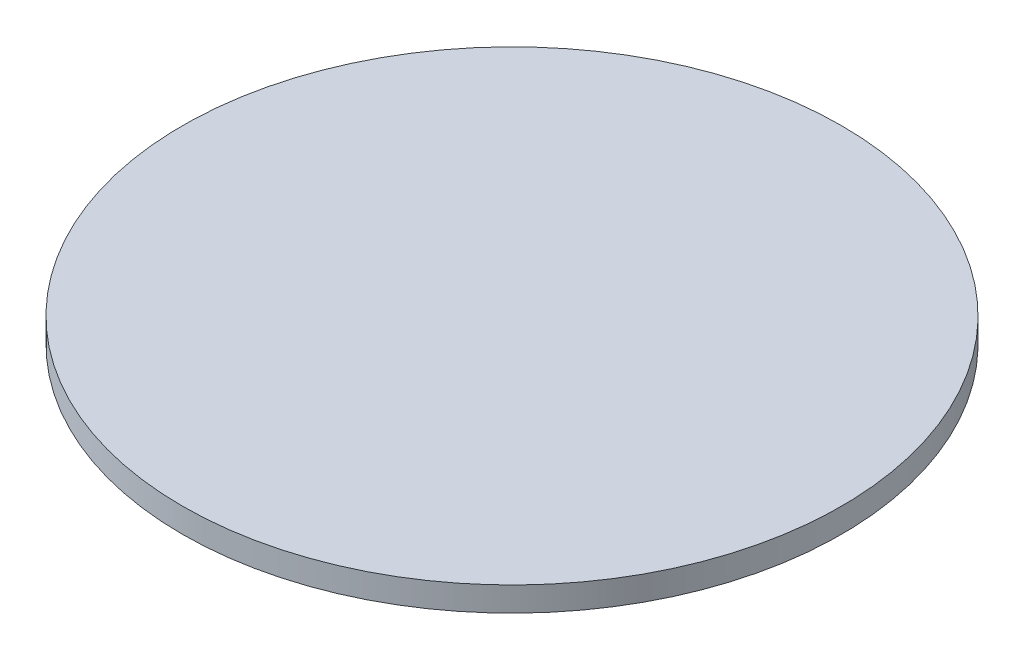
ISO-10303-21;
HEADER;
FILE_DESCRIPTION(('STEP AP214'),'2;1');
FILE_NAME('part.step','',(''),(''),'','','');
FILE_SCHEMA(('AUTOMOTIVE_DESIGN { 1 0 10303 214 1 1 1 1 }'));
ENDSEC;
DATA;
#1=APPLICATION_CONTEXT('core data for automotive mechanical design processes');
#2=APPLICATION_PROTOCOL_DEFINITION('international standard','automotive_design',2000,#1);
#3=PRODUCT_CONTEXT('',#1,'mechanical');
#4=PRODUCT('Part','Part','',(#3));
#5=PRODUCT_RELATED_PRODUCT_CATEGORY('part','',(#4));
#6=PRODUCT_DEFINITION_FORMATION('','',#4);
#7=PRODUCT_DEFINITION_CONTEXT('part definition',#1,'design');
#8=PRODUCT_DEFINITION('design','',#6,#7);
#9=PRODUCT_DEFINITION_SHAPE('','',#8);
#10=(LENGTH_UNIT() NAMED_UNIT(*) SI_UNIT(.MILLI.,.METRE.));
#11=(NAMED_UNIT(*) PLANE_ANGLE_UNIT() SI_UNIT($,.RADIAN.));
#12=(NAMED_UNIT(*) SI_UNIT($,.STERADIAN.) SOLID_ANGLE_UNIT());
#13=UNCERTAINTY_MEASURE_WITH_UNIT(LENGTH_MEASURE(1.E-05),#10,'distance_accuracy_value','');
#14=(GEOMETRIC_REPRESENTATION_CONTEXT(3) GLOBAL_UNCERTAINTY_ASSIGNED_CONTEXT((#13)) GLOBAL_UNIT_ASSIGNED_CONTEXT((#10,
#11,#12)) REPRESENTATION_CONTEXT('',''));
#15=CARTESIAN_POINT('',(0.,0.,0.));
#16=DIRECTION('',(0.,0.,1.));
#17=DIRECTION('',(1.,0.,0.));
#18=AXIS2_PLACEMENT_3D('',#15,#16,#17);
#19=CARTESIAN_POINT('',(0.,1.,0.));
#20=DIRECTION('',(0.,-1.,0.));
#21=DIRECTION('',(0.,0.,-1.));
#22=AXIS2_PLACEMENT_3D('',#19,#20,#21);
#23=CYLINDRICAL_SURFACE('',#22,13.5);
#24=CARTESIAN_POINT('',(0.,1.,0.));
#25=DIRECTION('',(0.,1.,0.));
#26=DIRECTION('',(0.,0.,1.));
#27=AXIS2_PLACEMENT_3D('',#24,#25,#26);
#28=CIRCLE('',#27,13.5);
#29=CARTESIAN_POINT('',(0.,1.,13.5));
#30=VERTEX_POINT('',#29);
#31=EDGE_CURVE('E10',#30,#30,#28,.T.);
#32=ORIENTED_EDGE('',*,*,#31,.F.);
#33=EDGE_LOOP('',(#32));
#34=FACE_BOUND('',#33,.T.);
#35=CARTESIAN_POINT('',(0.,0.,0.));
#36=DIRECTION('',(0.,1.,0.));
#37=DIRECTION('',(0.,0.,1.));
#38=AXIS2_PLACEMENT_3D('',#35,#36,#37);
#39=CIRCLE('',#38,13.5);
#40=CARTESIAN_POINT('',(0.,0.,13.5));
#41=VERTEX_POINT('',#40);
#42=EDGE_CURVE('E35',#41,#41,#39,.T.);
#43=ORIENTED_EDGE('',*,*,#42,.T.);
#44=EDGE_LOOP('',(#43));
#45=FACE_BOUND('',#44,.T.);
#46=ADVANCED_FACE('F32',(#34,#45),#23,.T.);
#47=CARTESIAN_POINT('',(0.,1.,0.));
#48=DIRECTION('',(0.,1.,0.));
#49=DIRECTION('',(0.,0.,1.));
#50=AXIS2_PLACEMENT_3D('',#47,#48,#49);
#51=PLANE('',#50);
#52=ORIENTED_EDGE('',*,*,#31,.T.);
#53=EDGE_LOOP('',(#52));
#54=FACE_BOUND('',#53,.T.);
#55=ADVANCED_FACE('F47',(#54),#51,.T.);
#56=CARTESIAN_POINT('',(0.,0.,0.));
#57=DIRECTION('',(0.,1.,0.));
#58=DIRECTION('',(0.,0.,1.));
#59=AXIS2_PLACEMENT_3D('',#56,#57,#58);
#60=PLANE('',#59);
#61=ORIENTED_EDGE('',*,*,#42,.F.);
#62=EDGE_LOOP('',(#61));
#63=FACE_BOUND('',#62,.T.);
#64=ADVANCED_FACE('F45',(#63),#60,.F.);
#65=CLOSED_SHELL('',(#46,#55,#64));
#66=MANIFOLD_SOLID_BREP('B2',#65);
#67=ADVANCED_BREP_SHAPE_REPRESENTATION('',(#18,#66),#14);
#68=SHAPE_DEFINITION_REPRESENTATION(#9,#67);
ENDSEC;
END-ISO-10303-21;
